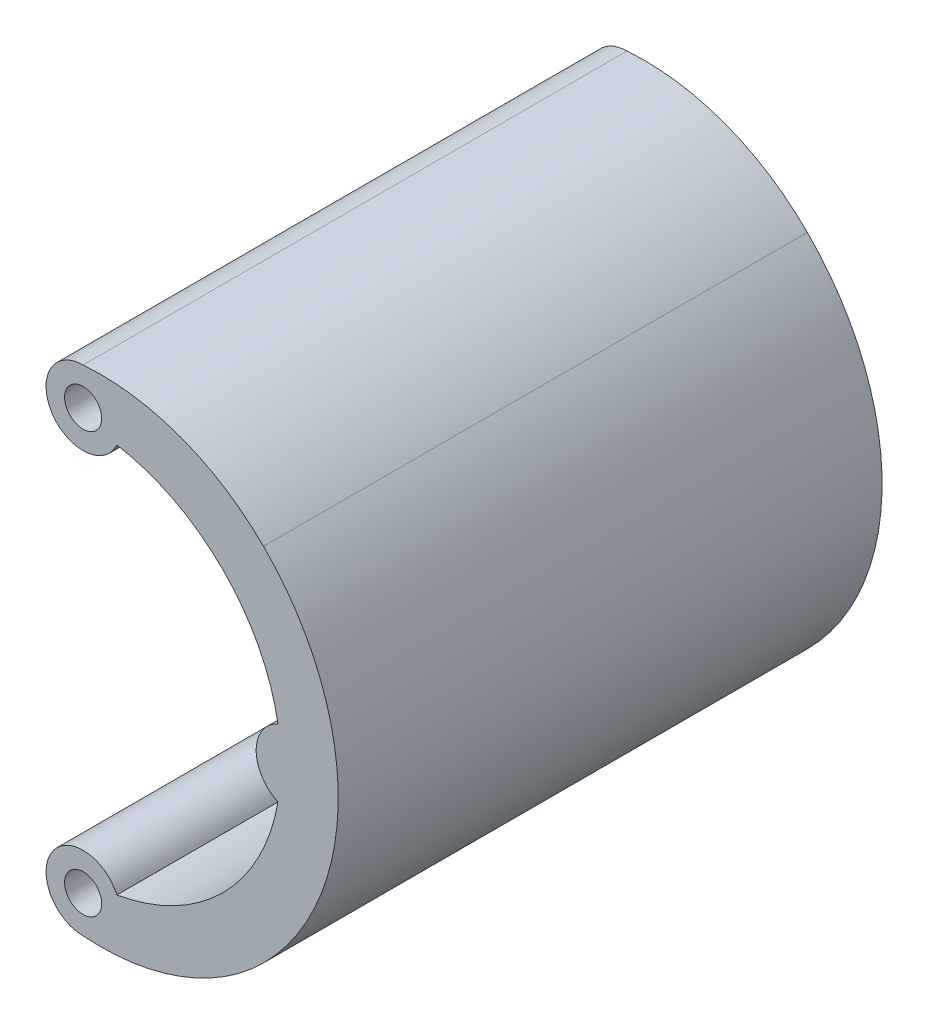
ISO-10303-21;
HEADER;
FILE_DESCRIPTION(('STEP AP214'),'2;1');
FILE_NAME('part.step','',(''),(''),'','','');
FILE_SCHEMA(('AUTOMOTIVE_DESIGN { 1 0 10303 214 1 1 1 1 }'));
ENDSEC;
DATA;
#1=APPLICATION_CONTEXT('core data for automotive mechanical design processes');
#2=APPLICATION_PROTOCOL_DEFINITION('international standard','automotive_design',2000,#1);
#3=PRODUCT_CONTEXT('',#1,'mechanical');
#4=PRODUCT('Part','Part','',(#3));
#5=PRODUCT_RELATED_PRODUCT_CATEGORY('part','',(#4));
#6=PRODUCT_DEFINITION_FORMATION('','',#4);
#7=PRODUCT_DEFINITION_CONTEXT('part definition',#1,'design');
#8=PRODUCT_DEFINITION('design','',#6,#7);
#9=PRODUCT_DEFINITION_SHAPE('','',#8);
#10=(LENGTH_UNIT() NAMED_UNIT(*) SI_UNIT(.MILLI.,.METRE.));
#11=(NAMED_UNIT(*) PLANE_ANGLE_UNIT() SI_UNIT($,.RADIAN.));
#12=(NAMED_UNIT(*) SI_UNIT($,.STERADIAN.) SOLID_ANGLE_UNIT());
#13=UNCERTAINTY_MEASURE_WITH_UNIT(LENGTH_MEASURE(1.E-05),#10,'distance_accuracy_value','');
#14=(GEOMETRIC_REPRESENTATION_CONTEXT(3) GLOBAL_UNCERTAINTY_ASSIGNED_CONTEXT((#13)) GLOBAL_UNIT_ASSIGNED_CONTEXT((#10,
#11,#12)) REPRESENTATION_CONTEXT('',''));
#15=CARTESIAN_POINT('',(0.,0.,0.));
#16=DIRECTION('',(0.,0.,1.));
#17=DIRECTION('',(1.,0.,0.));
#18=AXIS2_PLACEMENT_3D('',#15,#16,#17);
#19=CARTESIAN_POINT('',(0.,0.,44.));
#20=DIRECTION('',(0.,0.,-1.));
#21=DIRECTION('',(-1.,0.,0.));
#22=AXIS2_PLACEMENT_3D('',#19,#20,#21);
#23=CYLINDRICAL_SURFACE('',#22,16.);
#24=CARTESIAN_POINT('',(0.,0.,0.));
#25=DIRECTION('',(0.,0.,1.));
#26=DIRECTION('',(1.,0.,0.));
#27=AXIS2_PLACEMENT_3D('',#24,#25,#26);
#28=CIRCLE('',#27,16.);
#29=CARTESIAN_POINT('',(2.73387059732288,15.7647058823529,0.));
#30=VERTEX_POINT('',#29);
#31=CARTESIAN_POINT('',(15.7647058823529,2.73387059732288,0.));
#32=VERTEX_POINT('',#31);
#33=EDGE_CURVE('E139',#30,#32,#28,.F.);
#34=ORIENTED_EDGE('',*,*,#33,.T.);
#35=DIRECTION('',(0.,0.,-1.));
#36=VECTOR('',#35,1.);
#37=CARTESIAN_POINT('',(15.7647058823529,2.73387059732288,44.));
#38=LINE('',#37,#36);
#39=CARTESIAN_POINT('',(15.7647058823529,2.73387059732288,44.));
#40=VERTEX_POINT('',#39);
#41=EDGE_CURVE('E11',#40,#32,#38,.T.);
#42=ORIENTED_EDGE('',*,*,#41,.F.);
#43=CARTESIAN_POINT('',(0.,0.,44.));
#44=DIRECTION('',(0.,0.,1.));
#45=DIRECTION('',(1.,0.,0.));
#46=AXIS2_PLACEMENT_3D('',#43,#44,#45);
#47=CIRCLE('',#46,16.);
#48=CARTESIAN_POINT('',(2.73387059732288,15.7647058823529,44.));
#49=VERTEX_POINT('',#48);
#50=EDGE_CURVE('E154',#49,#40,#47,.F.);
#51=ORIENTED_EDGE('',*,*,#50,.F.);
#52=DIRECTION('',(0.,0.,-1.));
#53=VECTOR('',#52,1.);
#54=CARTESIAN_POINT('',(2.73387059732288,15.7647058823529,44.));
#55=LINE('',#54,#53);
#56=EDGE_CURVE('E135',#49,#30,#55,.T.);
#57=ORIENTED_EDGE('',*,*,#56,.T.);
#58=EDGE_LOOP('',(#34,#42,#51,#57));
#59=FACE_BOUND('',#58,.T.);
#60=ADVANCED_FACE('F43',(#59),#23,.F.);
#61=CARTESIAN_POINT('',(17.,0.,44.));
#62=DIRECTION('',(0.,0.,-1.));
#63=DIRECTION('',(-1.,0.,0.));
#64=AXIS2_PLACEMENT_3D('',#61,#62,#63);
#65=CYLINDRICAL_SURFACE('',#64,3.);
#66=CARTESIAN_POINT('',(17.,0.,0.));
#67=DIRECTION('',(0.,0.,1.));
#68=DIRECTION('',(1.,0.,0.));
#69=AXIS2_PLACEMENT_3D('',#66,#67,#68);
#70=CIRCLE('',#69,3.);
#71=CARTESIAN_POINT('',(15.7647058823529,-2.73387059732288,0.));
#72=VERTEX_POINT('',#71);
#73=EDGE_CURVE('E142',#32,#72,#70,.T.);
#74=ORIENTED_EDGE('',*,*,#73,.T.);
#75=DIRECTION('',(0.,0.,-1.));
#76=VECTOR('',#75,1.);
#77=CARTESIAN_POINT('',(15.7647058823529,-2.73387059732288,44.));
#78=LINE('',#77,#76);
#79=CARTESIAN_POINT('',(15.7647058823529,-2.73387059732288,44.));
#80=VERTEX_POINT('',#79);
#81=EDGE_CURVE('E51',#80,#72,#78,.T.);
#82=ORIENTED_EDGE('',*,*,#81,.F.);
#83=CARTESIAN_POINT('',(17.,0.,44.));
#84=DIRECTION('',(0.,0.,1.));
#85=DIRECTION('',(1.,0.,0.));
#86=AXIS2_PLACEMENT_3D('',#83,#84,#85);
#87=CIRCLE('',#86,3.);
#88=EDGE_CURVE('E102',#40,#80,#87,.T.);
#89=ORIENTED_EDGE('',*,*,#88,.F.);
#90=ORIENTED_EDGE('',*,*,#41,.T.);
#91=EDGE_LOOP('',(#74,#82,#89,#90));
#92=FACE_BOUND('',#91,.T.);
#93=ADVANCED_FACE('F228',(#92),#65,.T.);
#94=CARTESIAN_POINT('',(0.,0.,44.));
#95=DIRECTION('',(0.,0.,-1.));
#96=DIRECTION('',(-1.,0.,0.));
#97=AXIS2_PLACEMENT_3D('',#94,#95,#96);
#98=CYLINDRICAL_SURFACE('',#97,16.);
#99=CARTESIAN_POINT('',(0.,0.,0.));
#100=DIRECTION('',(0.,0.,1.));
#101=DIRECTION('',(1.,0.,0.));
#102=AXIS2_PLACEMENT_3D('',#99,#100,#101);
#103=CIRCLE('',#102,16.);
#104=CARTESIAN_POINT('',(2.73387059732288,-15.7647058823529,0.));
#105=VERTEX_POINT('',#104);
#106=EDGE_CURVE('E145',#72,#105,#103,.F.);
#107=ORIENTED_EDGE('',*,*,#106,.T.);
#108=DIRECTION('',(0.,0.,-1.));
#109=VECTOR('',#108,1.);
#110=CARTESIAN_POINT('',(2.73387059732288,-15.7647058823529,44.));
#111=LINE('',#110,#109);
#112=CARTESIAN_POINT('',(2.73387059732288,-15.7647058823529,44.));
#113=VERTEX_POINT('',#112);
#114=EDGE_CURVE('E161',#113,#105,#111,.T.);
#115=ORIENTED_EDGE('',*,*,#114,.F.);
#116=CARTESIAN_POINT('',(0.,0.,44.));
#117=DIRECTION('',(0.,0.,1.));
#118=DIRECTION('',(1.,0.,0.));
#119=AXIS2_PLACEMENT_3D('',#116,#117,#118);
#120=CIRCLE('',#119,16.);
#121=EDGE_CURVE('E169',#80,#113,#120,.F.);
#122=ORIENTED_EDGE('',*,*,#121,.F.);
#123=ORIENTED_EDGE('',*,*,#81,.T.);
#124=EDGE_LOOP('',(#107,#115,#122,#123));
#125=FACE_BOUND('',#124,.T.);
#126=ADVANCED_FACE('F167',(#125),#98,.F.);
#127=CARTESIAN_POINT('',(0.,-17.,44.));
#128=DIRECTION('',(0.,0.,-1.));
#129=DIRECTION('',(-1.,0.,0.));
#130=AXIS2_PLACEMENT_3D('',#127,#128,#129);
#131=CYLINDRICAL_SURFACE('',#130,3.);
#132=CARTESIAN_POINT('',(0.,-17.,0.));
#133=DIRECTION('',(0.,0.,1.));
#134=DIRECTION('',(1.,0.,0.));
#135=AXIS2_PLACEMENT_3D('',#132,#133,#134);
#136=CIRCLE('',#135,3.);
#137=CARTESIAN_POINT('',(0.,-20.,0.));
#138=VERTEX_POINT('',#137);
#139=EDGE_CURVE('E147',#105,#138,#136,.T.);
#140=ORIENTED_EDGE('',*,*,#139,.T.);
#141=DIRECTION('',(0.,0.,-1.));
#142=VECTOR('',#141,1.);
#143=CARTESIAN_POINT('',(0.,-20.,44.));
#144=LINE('',#143,#142);
#145=CARTESIAN_POINT('',(0.,-20.,44.));
#146=VERTEX_POINT('',#145);
#147=EDGE_CURVE('E158',#146,#138,#144,.T.);
#148=ORIENTED_EDGE('',*,*,#147,.F.);
#149=CARTESIAN_POINT('',(0.,-17.,44.));
#150=DIRECTION('',(0.,0.,1.));
#151=DIRECTION('',(1.,0.,0.));
#152=AXIS2_PLACEMENT_3D('',#149,#150,#151);
#153=CIRCLE('',#152,3.);
#154=EDGE_CURVE('E181',#113,#146,#153,.T.);
#155=ORIENTED_EDGE('',*,*,#154,.F.);
#156=ORIENTED_EDGE('',*,*,#114,.T.);
#157=EDGE_LOOP('',(#140,#148,#155,#156));
#158=FACE_BOUND('',#157,.T.);
#159=ADVANCED_FACE('F177',(#158),#131,.T.);
#160=CARTESIAN_POINT('',(1.4142135623731,-1.41421356237309,44.));
#161=DIRECTION('',(0.,0.,-1.));
#162=DIRECTION('',(-1.,0.,0.));
#163=AXIS2_PLACEMENT_3D('',#160,#161,#162);
#164=CYLINDRICAL_SURFACE('',#163,18.6395133387403);
#165=CARTESIAN_POINT('',(1.4142135623731,-1.41421356237309,0.));
#166=DIRECTION('',(0.,0.,1.));
#167=DIRECTION('',(1.,0.,0.));
#168=AXIS2_PLACEMENT_3D('',#165,#166,#167);
#169=CIRCLE('',#168,18.6395133387403);
#170=CARTESIAN_POINT('',(14.5943398422135,-14.5943398422134,0.));
#171=VERTEX_POINT('',#170);
#172=EDGE_CURVE('E149',#138,#171,#169,.T.);
#173=ORIENTED_EDGE('',*,*,#172,.T.);
#174=DIRECTION('',(0.,0.,-1.));
#175=VECTOR('',#174,1.);
#176=CARTESIAN_POINT('',(14.5943398422135,-14.5943398422134,44.));
#177=LINE('',#176,#175);
#178=CARTESIAN_POINT('',(14.5943398422135,-14.5943398422134,44.));
#179=VERTEX_POINT('',#178);
#180=EDGE_CURVE('E130',#179,#171,#177,.T.);
#181=ORIENTED_EDGE('',*,*,#180,.F.);
#182=CARTESIAN_POINT('',(1.4142135623731,-1.41421356237309,44.));
#183=DIRECTION('',(0.,0.,1.));
#184=DIRECTION('',(1.,0.,0.));
#185=AXIS2_PLACEMENT_3D('',#182,#183,#184);
#186=CIRCLE('',#185,18.6395133387403);
#187=EDGE_CURVE('E121',#146,#179,#186,.T.);
#188=ORIENTED_EDGE('',*,*,#187,.F.);
#189=ORIENTED_EDGE('',*,*,#147,.T.);
#190=EDGE_LOOP('',(#173,#181,#188,#189));
#191=FACE_BOUND('',#190,.T.);
#192=ADVANCED_FACE('F180',(#191),#164,.T.);
#193=CARTESIAN_POINT('',(0.,0.,44.));
#194=DIRECTION('',(0.,0.,-1.));
#195=DIRECTION('',(-1.,0.,0.));
#196=AXIS2_PLACEMENT_3D('',#193,#194,#195);
#197=CYLINDRICAL_SURFACE('',#196,20.6395133387403);
#198=CARTESIAN_POINT('',(0.,0.,0.));
#199=DIRECTION('',(0.,0.,1.));
#200=DIRECTION('',(1.,0.,0.));
#201=AXIS2_PLACEMENT_3D('',#198,#199,#200);
#202=CIRCLE('',#201,20.6395133387403);
#203=CARTESIAN_POINT('',(14.5943398422134,14.5943398422135,0.));
#204=VERTEX_POINT('',#203);
#205=EDGE_CURVE('E129',#171,#204,#202,.T.);
#206=ORIENTED_EDGE('',*,*,#205,.T.);
#207=DIRECTION('',(0.,0.,-1.));
#208=VECTOR('',#207,1.);
#209=CARTESIAN_POINT('',(14.5943398422134,14.5943398422135,44.));
#210=LINE('',#209,#208);
#211=CARTESIAN_POINT('',(14.5943398422134,14.5943398422135,44.));
#212=VERTEX_POINT('',#211);
#213=EDGE_CURVE('E126',#212,#204,#210,.T.);
#214=ORIENTED_EDGE('',*,*,#213,.F.);
#215=CARTESIAN_POINT('',(0.,0.,44.));
#216=DIRECTION('',(0.,0.,1.));
#217=DIRECTION('',(1.,0.,0.));
#218=AXIS2_PLACEMENT_3D('',#215,#216,#217);
#219=CIRCLE('',#218,20.6395133387403);
#220=EDGE_CURVE('E115',#179,#212,#219,.T.);
#221=ORIENTED_EDGE('',*,*,#220,.F.);
#222=ORIENTED_EDGE('',*,*,#180,.T.);
#223=EDGE_LOOP('',(#206,#214,#221,#222));
#224=FACE_BOUND('',#223,.T.);
#225=ADVANCED_FACE('F127',(#224),#197,.T.);
#226=CARTESIAN_POINT('',(1.41421356237309,1.4142135623731,44.));
#227=DIRECTION('',(0.,0.,-1.));
#228=DIRECTION('',(-1.,0.,0.));
#229=AXIS2_PLACEMENT_3D('',#226,#227,#228);
#230=CYLINDRICAL_SURFACE('',#229,18.6395133387403);
#231=CARTESIAN_POINT('',(1.41421356237309,1.4142135623731,0.));
#232=DIRECTION('',(0.,0.,1.));
#233=DIRECTION('',(1.,0.,0.));
#234=AXIS2_PLACEMENT_3D('',#231,#232,#233);
#235=CIRCLE('',#234,18.6395133387403);
#236=CARTESIAN_POINT('',(-1.9857162789072E-13,20.,0.));
#237=VERTEX_POINT('',#236);
#238=EDGE_CURVE('E88',#204,#237,#235,.T.);
#239=ORIENTED_EDGE('',*,*,#238,.T.);
#240=DIRECTION('',(0.,0.,-1.));
#241=VECTOR('',#240,1.);
#242=CARTESIAN_POINT('',(-1.9857162789072E-13,20.,44.));
#243=LINE('',#242,#241);
#244=CARTESIAN_POINT('',(-1.9857162789072E-13,20.,44.));
#245=VERTEX_POINT('',#244);
#246=EDGE_CURVE('E131',#245,#237,#243,.T.);
#247=ORIENTED_EDGE('',*,*,#246,.F.);
#248=CARTESIAN_POINT('',(1.41421356237309,1.4142135623731,44.));
#249=DIRECTION('',(0.,0.,1.));
#250=DIRECTION('',(1.,0.,0.));
#251=AXIS2_PLACEMENT_3D('',#248,#249,#250);
#252=CIRCLE('',#251,18.6395133387403);
#253=EDGE_CURVE('E119',#212,#245,#252,.T.);
#254=ORIENTED_EDGE('',*,*,#253,.F.);
#255=ORIENTED_EDGE('',*,*,#213,.T.);
#256=EDGE_LOOP('',(#239,#247,#254,#255));
#257=FACE_BOUND('',#256,.T.);
#258=ADVANCED_FACE('F133',(#257),#230,.T.);
#259=CARTESIAN_POINT('',(0.,17.,44.));
#260=DIRECTION('',(0.,0.,-1.));
#261=DIRECTION('',(-1.,0.,0.));
#262=AXIS2_PLACEMENT_3D('',#259,#260,#261);
#263=CYLINDRICAL_SURFACE('',#262,3.);
#264=CARTESIAN_POINT('',(0.,17.,0.));
#265=DIRECTION('',(0.,0.,1.));
#266=DIRECTION('',(1.,0.,0.));
#267=AXIS2_PLACEMENT_3D('',#264,#265,#266);
#268=CIRCLE('',#267,3.);
#269=EDGE_CURVE('E94',#237,#30,#268,.T.);
#270=ORIENTED_EDGE('',*,*,#269,.T.);
#271=ORIENTED_EDGE('',*,*,#56,.F.);
#272=CARTESIAN_POINT('',(0.,17.,44.));
#273=DIRECTION('',(0.,0.,1.));
#274=DIRECTION('',(1.,0.,0.));
#275=AXIS2_PLACEMENT_3D('',#272,#273,#274);
#276=CIRCLE('',#275,3.);
#277=EDGE_CURVE('E59',#245,#49,#276,.T.);
#278=ORIENTED_EDGE('',*,*,#277,.F.);
#279=ORIENTED_EDGE('',*,*,#246,.T.);
#280=EDGE_LOOP('',(#270,#271,#278,#279));
#281=FACE_BOUND('',#280,.T.);
#282=ADVANCED_FACE('F235',(#281),#263,.T.);
#283=CARTESIAN_POINT('',(0.,0.,44.));
#284=DIRECTION('',(0.,0.,1.));
#285=DIRECTION('',(1.,0.,0.));
#286=AXIS2_PLACEMENT_3D('',#283,#284,#285);
#287=PLANE('',#286);
#288=CARTESIAN_POINT('',(0.,17.,44.));
#289=DIRECTION('',(0.,0.,-1.));
#290=DIRECTION('',(-1.,0.,0.));
#291=AXIS2_PLACEMENT_3D('',#288,#289,#290);
#292=CIRCLE('',#291,1.49999999999999);
#293=CARTESIAN_POINT('',(-1.49999999999999,17.,44.));
#294=VERTEX_POINT('',#293);
#295=EDGE_CURVE('E195',#294,#294,#292,.T.);
#296=ORIENTED_EDGE('',*,*,#295,.T.);
#297=EDGE_LOOP('',(#296));
#298=FACE_BOUND('',#297,.T.);
#299=CARTESIAN_POINT('',(0.,-17.,44.));
#300=DIRECTION('',(0.,0.,-1.));
#301=DIRECTION('',(-1.,0.,0.));
#302=AXIS2_PLACEMENT_3D('',#299,#300,#301);
#303=CIRCLE('',#302,1.49999999999999);
#304=CARTESIAN_POINT('',(-1.49999999999999,-17.,44.));
#305=VERTEX_POINT('',#304);
#306=EDGE_CURVE('E143',#305,#305,#303,.T.);
#307=ORIENTED_EDGE('',*,*,#306,.T.);
#308=EDGE_LOOP('',(#307));
#309=FACE_BOUND('',#308,.T.);
#310=ORIENTED_EDGE('',*,*,#50,.T.);
#311=ORIENTED_EDGE('',*,*,#88,.T.);
#312=ORIENTED_EDGE('',*,*,#121,.T.);
#313=ORIENTED_EDGE('',*,*,#154,.T.);
#314=ORIENTED_EDGE('',*,*,#187,.T.);
#315=ORIENTED_EDGE('',*,*,#220,.T.);
#316=ORIENTED_EDGE('',*,*,#253,.T.);
#317=ORIENTED_EDGE('',*,*,#277,.T.);
#318=EDGE_LOOP('',(#310,#311,#312,#313,#314,#315,#316,#317));
#319=FACE_BOUND('',#318,.T.);
#320=ADVANCED_FACE('F117',(#298,#309,#319),#287,.T.);
#321=CARTESIAN_POINT('',(0.,0.,0.));
#322=DIRECTION('',(0.,0.,1.));
#323=DIRECTION('',(1.,0.,0.));
#324=AXIS2_PLACEMENT_3D('',#321,#322,#323);
#325=PLANE('',#324);
#326=CARTESIAN_POINT('',(0.,17.,0.));
#327=DIRECTION('',(0.,0.,-1.));
#328=DIRECTION('',(-1.,0.,0.));
#329=AXIS2_PLACEMENT_3D('',#326,#327,#328);
#330=CIRCLE('',#329,1.525);
#331=CARTESIAN_POINT('',(-1.525,17.,0.));
#332=VERTEX_POINT('',#331);
#333=EDGE_CURVE('E201',#332,#332,#330,.T.);
#334=ORIENTED_EDGE('',*,*,#333,.F.);
#335=EDGE_LOOP('',(#334));
#336=FACE_BOUND('',#335,.T.);
#337=CARTESIAN_POINT('',(0.,-17.,0.));
#338=DIRECTION('',(0.,0.,-1.));
#339=DIRECTION('',(-1.,0.,0.));
#340=AXIS2_PLACEMENT_3D('',#337,#338,#339);
#341=CIRCLE('',#340,1.525);
#342=CARTESIAN_POINT('',(-1.525,-17.,0.));
#343=VERTEX_POINT('',#342);
#344=EDGE_CURVE('E192',#343,#343,#341,.T.);
#345=ORIENTED_EDGE('',*,*,#344,.F.);
#346=EDGE_LOOP('',(#345));
#347=FACE_BOUND('',#346,.T.);
#348=ORIENTED_EDGE('',*,*,#33,.F.);
#349=ORIENTED_EDGE('',*,*,#269,.F.);
#350=ORIENTED_EDGE('',*,*,#238,.F.);
#351=ORIENTED_EDGE('',*,*,#205,.F.);
#352=ORIENTED_EDGE('',*,*,#172,.F.);
#353=ORIENTED_EDGE('',*,*,#139,.F.);
#354=ORIENTED_EDGE('',*,*,#106,.F.);
#355=ORIENTED_EDGE('',*,*,#73,.F.);
#356=EDGE_LOOP('',(#348,#349,#350,#351,#352,#353,#354,#355));
#357=FACE_BOUND('',#356,.T.);
#358=ADVANCED_FACE('F173',(#336,#347,#357),#325,.F.);
#359=CARTESIAN_POINT('',(0.,-17.,0.));
#360=DIRECTION('',(0.,0.,-1.));
#361=DIRECTION('',(-1.,0.,0.));
#362=AXIS2_PLACEMENT_3D('',#359,#360,#361);
#363=CYLINDRICAL_SURFACE('',#362,1.49999999999999);
#364=ORIENTED_EDGE('',*,*,#306,.F.);
#365=EDGE_LOOP('',(#364));
#366=FACE_BOUND('',#365,.T.);
#367=CARTESIAN_POINT('',(0.,-17.,0.0209774907794363));
#368=DIRECTION('',(0.,0.,-1.));
#369=DIRECTION('',(-1.,0.,0.));
#370=AXIS2_PLACEMENT_3D('',#367,#368,#369);
#371=CIRCLE('',#370,1.5);
#372=CARTESIAN_POINT('',(-1.5,-17.,0.0209774907794363));
#373=VERTEX_POINT('',#372);
#374=EDGE_CURVE('E189',#373,#373,#371,.T.);
#375=ORIENTED_EDGE('',*,*,#374,.T.);
#376=EDGE_LOOP('',(#375));
#377=FACE_BOUND('',#376,.T.);
#378=ADVANCED_FACE('F209',(#366,#377),#363,.F.);
#379=CARTESIAN_POINT('',(0.,-17.,0.));
#380=DIRECTION('',(0.,0.,-1.));
#381=DIRECTION('',(-1.,0.,0.));
#382=AXIS2_PLACEMENT_3D('',#379,#380,#381);
#383=CONICAL_SURFACE('',#382,1.525,0.872664625997103);
#384=ORIENTED_EDGE('',*,*,#374,.F.);
#385=EDGE_LOOP('',(#384));
#386=FACE_BOUND('',#385,.T.);
#387=ORIENTED_EDGE('',*,*,#344,.T.);
#388=EDGE_LOOP('',(#387));
#389=FACE_BOUND('',#388,.T.);
#390=ADVANCED_FACE('F213',(#386,#389),#383,.F.);
#391=CARTESIAN_POINT('',(0.,17.,0.));
#392=DIRECTION('',(0.,0.,-1.));
#393=DIRECTION('',(-1.,0.,0.));
#394=AXIS2_PLACEMENT_3D('',#391,#392,#393);
#395=CYLINDRICAL_SURFACE('',#394,1.49999999999999);
#396=ORIENTED_EDGE('',*,*,#295,.F.);
#397=EDGE_LOOP('',(#396));
#398=FACE_BOUND('',#397,.T.);
#399=CARTESIAN_POINT('',(0.,17.,0.0209774907794363));
#400=DIRECTION('',(0.,0.,-1.));
#401=DIRECTION('',(-1.,0.,0.));
#402=AXIS2_PLACEMENT_3D('',#399,#400,#401);
#403=CIRCLE('',#402,1.5);
#404=CARTESIAN_POINT('',(-1.5,17.,0.0209774907794363));
#405=VERTEX_POINT('',#404);
#406=EDGE_CURVE('E198',#405,#405,#403,.T.);
#407=ORIENTED_EDGE('',*,*,#406,.T.);
#408=EDGE_LOOP('',(#407));
#409=FACE_BOUND('',#408,.T.);
#410=ADVANCED_FACE('F215',(#398,#409),#395,.F.);
#411=CARTESIAN_POINT('',(0.,17.,0.));
#412=DIRECTION('',(0.,0.,-1.));
#413=DIRECTION('',(-1.,0.,0.));
#414=AXIS2_PLACEMENT_3D('',#411,#412,#413);
#415=CONICAL_SURFACE('',#414,1.525,0.872664625997103);
#416=ORIENTED_EDGE('',*,*,#406,.F.);
#417=EDGE_LOOP('',(#416));
#418=FACE_BOUND('',#417,.T.);
#419=ORIENTED_EDGE('',*,*,#333,.T.);
#420=EDGE_LOOP('',(#419));
#421=FACE_BOUND('',#420,.T.);
#422=ADVANCED_FACE('F205',(#418,#421),#415,.F.);
#423=CLOSED_SHELL('',(#60,#93,#126,#159,#192,#225,#258,#282,#320,#358,#378,#390,#410,#422));
#424=MANIFOLD_SOLID_BREP('B2',#423);
#425=ADVANCED_BREP_SHAPE_REPRESENTATION('',(#18,#424),#14);
#426=SHAPE_DEFINITION_REPRESENTATION(#9,#425);
ENDSEC;
END-ISO-10303-21;
